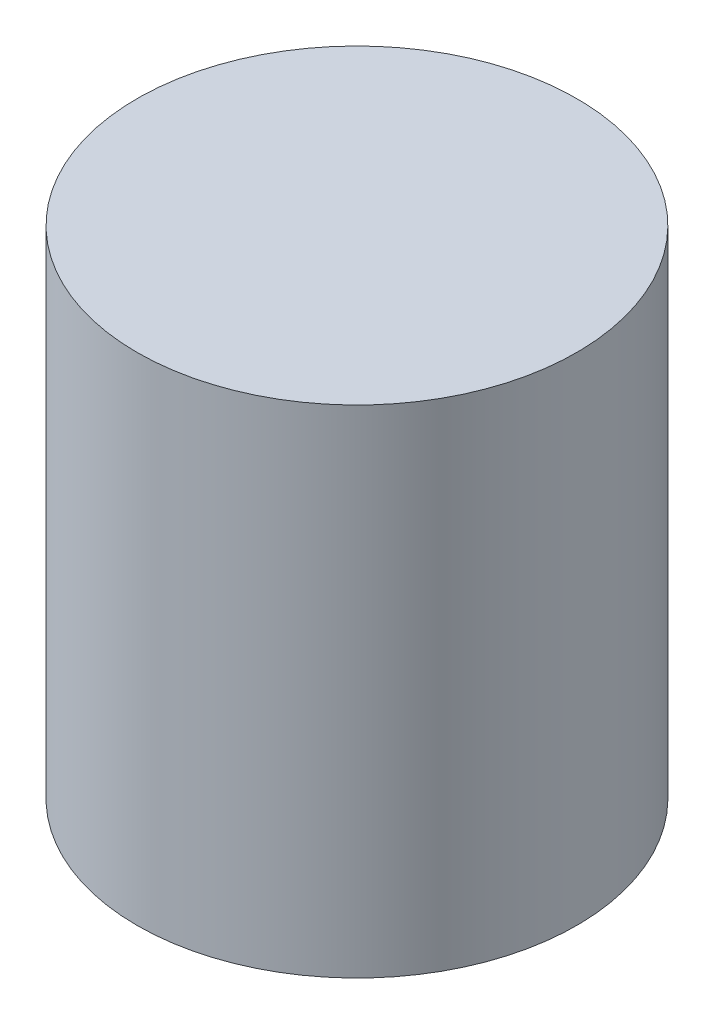
ISO-10303-21;
HEADER;
FILE_DESCRIPTION(('STEP AP214'),'2;1');
FILE_NAME('part.step','',(''),(''),'','','');
FILE_SCHEMA(('AUTOMOTIVE_DESIGN { 1 0 10303 214 1 1 1 1 }'));
ENDSEC;
DATA;
#1=APPLICATION_CONTEXT('core data for automotive mechanical design processes');
#2=APPLICATION_PROTOCOL_DEFINITION('international standard','automotive_design',2000,#1);
#3=PRODUCT_CONTEXT('',#1,'mechanical');
#4=PRODUCT('Part','Part','',(#3));
#5=PRODUCT_RELATED_PRODUCT_CATEGORY('part','',(#4));
#6=PRODUCT_DEFINITION_FORMATION('','',#4);
#7=PRODUCT_DEFINITION_CONTEXT('part definition',#1,'design');
#8=PRODUCT_DEFINITION('design','',#6,#7);
#9=PRODUCT_DEFINITION_SHAPE('','',#8);
#10=(LENGTH_UNIT() NAMED_UNIT(*) SI_UNIT(.MILLI.,.METRE.));
#11=(NAMED_UNIT(*) PLANE_ANGLE_UNIT() SI_UNIT($,.RADIAN.));
#12=(NAMED_UNIT(*) SI_UNIT($,.STERADIAN.) SOLID_ANGLE_UNIT());
#13=UNCERTAINTY_MEASURE_WITH_UNIT(LENGTH_MEASURE(1.E-05),#10,'distance_accuracy_value','');
#14=(GEOMETRIC_REPRESENTATION_CONTEXT(3) GLOBAL_UNCERTAINTY_ASSIGNED_CONTEXT((#13)) GLOBAL_UNIT_ASSIGNED_CONTEXT((#10,
#11,#12)) REPRESENTATION_CONTEXT('',''));
#15=CARTESIAN_POINT('',(0.,0.,0.));
#16=DIRECTION('',(0.,0.,1.));
#17=DIRECTION('',(1.,0.,0.));
#18=AXIS2_PLACEMENT_3D('',#15,#16,#17);
#19=CARTESIAN_POINT('',(0.,3.95,0.));
#20=DIRECTION('',(0.,-1.,0.));
#21=DIRECTION('',(0.,0.,-1.));
#22=AXIS2_PLACEMENT_3D('',#19,#20,#21);
#23=CYLINDRICAL_SURFACE('',#22,1.75);
#24=CARTESIAN_POINT('',(0.,3.95,0.));
#25=DIRECTION('',(0.,1.,0.));
#26=DIRECTION('',(0.,0.,1.));
#27=AXIS2_PLACEMENT_3D('',#24,#25,#26);
#28=CIRCLE('',#27,1.75);
#29=CARTESIAN_POINT('',(0.,3.95,1.75));
#30=VERTEX_POINT('',#29);
#31=EDGE_CURVE('E10',#30,#30,#28,.T.);
#32=ORIENTED_EDGE('',*,*,#31,.F.);
#33=EDGE_LOOP('',(#32));
#34=FACE_BOUND('',#33,.T.);
#35=CARTESIAN_POINT('',(0.,0.,0.));
#36=DIRECTION('',(0.,1.,0.));
#37=DIRECTION('',(0.,0.,1.));
#38=AXIS2_PLACEMENT_3D('',#35,#36,#37);
#39=CIRCLE('',#38,1.75);
#40=CARTESIAN_POINT('',(0.,0.,1.75));
#41=VERTEX_POINT('',#40);
#42=EDGE_CURVE('E33',#41,#41,#39,.T.);
#43=ORIENTED_EDGE('',*,*,#42,.T.);
#44=EDGE_LOOP('',(#43));
#45=FACE_BOUND('',#44,.T.);
#46=ADVANCED_FACE('F30',(#34,#45),#23,.T.);
#47=CARTESIAN_POINT('',(0.,3.95,0.));
#48=DIRECTION('',(0.,1.,0.));
#49=DIRECTION('',(0.,0.,1.));
#50=AXIS2_PLACEMENT_3D('',#47,#48,#49);
#51=PLANE('',#50);
#52=ORIENTED_EDGE('',*,*,#31,.T.);
#53=EDGE_LOOP('',(#52));
#54=FACE_BOUND('',#53,.T.);
#55=ADVANCED_FACE('F45',(#54),#51,.T.);
#56=CARTESIAN_POINT('',(0.,0.,0.));
#57=DIRECTION('',(0.,1.,0.));
#58=DIRECTION('',(0.,0.,1.));
#59=AXIS2_PLACEMENT_3D('',#56,#57,#58);
#60=PLANE('',#59);
#61=ORIENTED_EDGE('',*,*,#42,.F.);
#62=EDGE_LOOP('',(#61));
#63=FACE_BOUND('',#62,.T.);
#64=ADVANCED_FACE('F43',(#63),#60,.F.);
#65=CLOSED_SHELL('',(#46,#55,#64));
#66=MANIFOLD_SOLID_BREP('B2',#65);
#67=ADVANCED_BREP_SHAPE_REPRESENTATION('',(#18,#66),#14);
#68=SHAPE_DEFINITION_REPRESENTATION(#9,#67);
ENDSEC;
END-ISO-10303-21;
